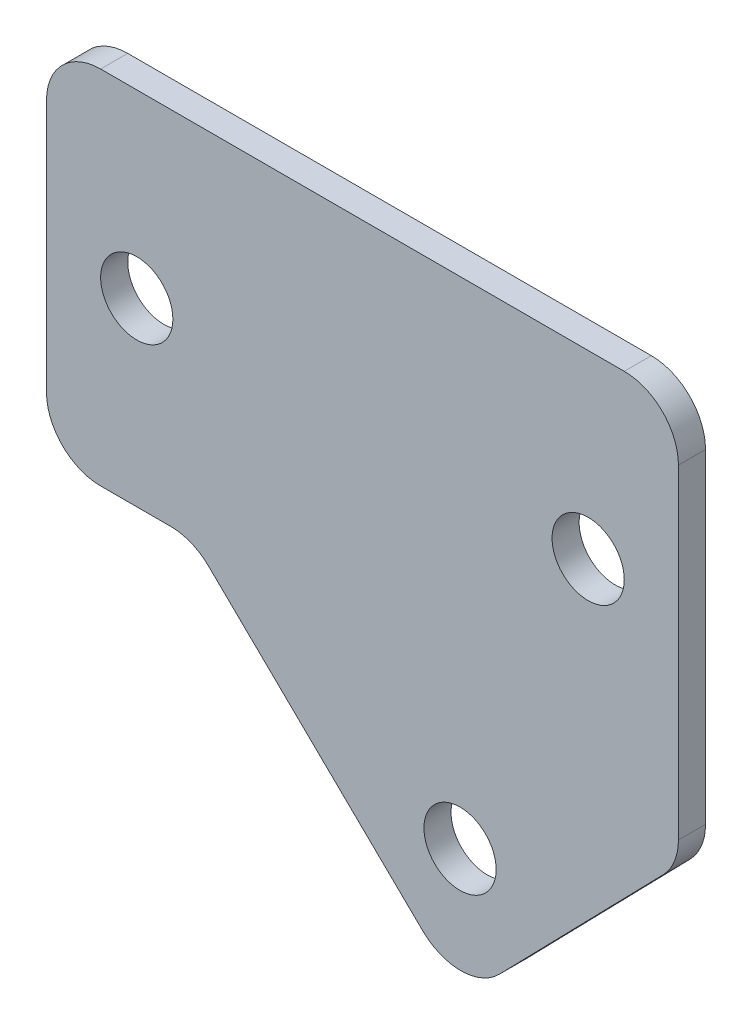
ISO-10303-21;
HEADER;
FILE_DESCRIPTION(('STEP AP214'),'2;1');
FILE_NAME('part.step','',(''),(''),'','','');
FILE_SCHEMA(('AUTOMOTIVE_DESIGN { 1 0 10303 214 1 1 1 1 }'));
ENDSEC;
DATA;
#1=APPLICATION_CONTEXT('core data for automotive mechanical design processes');
#2=APPLICATION_PROTOCOL_DEFINITION('international standard','automotive_design',2000,#1);
#3=PRODUCT_CONTEXT('',#1,'mechanical');
#4=PRODUCT('Part','Part','',(#3));
#5=PRODUCT_RELATED_PRODUCT_CATEGORY('part','',(#4));
#6=PRODUCT_DEFINITION_FORMATION('','',#4);
#7=PRODUCT_DEFINITION_CONTEXT('part definition',#1,'design');
#8=PRODUCT_DEFINITION('design','',#6,#7);
#9=PRODUCT_DEFINITION_SHAPE('','',#8);
#10=(LENGTH_UNIT() NAMED_UNIT(*) SI_UNIT(.MILLI.,.METRE.));
#11=(NAMED_UNIT(*) PLANE_ANGLE_UNIT() SI_UNIT($,.RADIAN.));
#12=(NAMED_UNIT(*) SI_UNIT($,.STERADIAN.) SOLID_ANGLE_UNIT());
#13=UNCERTAINTY_MEASURE_WITH_UNIT(LENGTH_MEASURE(1.E-05),#10,'distance_accuracy_value','');
#14=(GEOMETRIC_REPRESENTATION_CONTEXT(3) GLOBAL_UNCERTAINTY_ASSIGNED_CONTEXT((#13)) GLOBAL_UNIT_ASSIGNED_CONTEXT((#10,
#11,#12)) REPRESENTATION_CONTEXT('',''));
#15=CARTESIAN_POINT('',(0.,0.,0.));
#16=DIRECTION('',(0.,0.,1.));
#17=DIRECTION('',(1.,0.,0.));
#18=AXIS2_PLACEMENT_3D('',#15,#16,#17);
#19=CARTESIAN_POINT('',(-5.94977197285387,-6.10547946473669,1.5));
#20=DIRECTION('',(0.697915467486602,0.716180145105237,0.));
#21=DIRECTION('',(-0.716180145105237,0.697915467486602,0.));
#22=AXIS2_PLACEMENT_3D('',#19,#20,#21);
#23=PLANE('',#22);
#24=DIRECTION('',(0.716180145105237,-0.697915467486602,0.));
#25=VECTOR('',#24,1.);
#26=CARTESIAN_POINT('',(-5.94977197285387,-6.10547946473669,1.5));
#27=LINE('',#26,#25);
#28=CARTESIAN_POINT('',(-8.52874557914507,-3.59227718962217,1.5));
#29=VERTEX_POINT('',#28);
#30=CARTESIAN_POINT('',(3.34728658040838,-15.1654359726023,1.5));
#31=VERTEX_POINT('',#30);
#32=EDGE_CURVE('E141',#29,#31,#27,.T.);
#33=ORIENTED_EDGE('',*,*,#32,.F.);
#34=DIRECTION('',(0.,0.,-1.));
#35=VECTOR('',#34,1.);
#36=CARTESIAN_POINT('',(-8.52874557914507,-3.59227718962217,0.));
#37=LINE('',#36,#35);
#38=CARTESIAN_POINT('',(-8.52874557914507,-3.59227718962217,0.));
#39=VERTEX_POINT('',#38);
#40=EDGE_CURVE('E128',#29,#39,#37,.T.);
#41=ORIENTED_EDGE('',*,*,#40,.T.);
#42=DIRECTION('',(0.716180145105237,-0.697915467486602,0.));
#43=VECTOR('',#42,1.);
#44=CARTESIAN_POINT('',(-5.94977197285387,-6.10547946473669,0.));
#45=LINE('',#44,#43);
#46=CARTESIAN_POINT('',(3.34728658040838,-15.1654359726023,0.));
#47=VERTEX_POINT('',#46);
#48=EDGE_CURVE('E138',#39,#47,#45,.T.);
#49=ORIENTED_EDGE('',*,*,#48,.T.);
#50=DIRECTION('',(0.,0.,-1.));
#51=VECTOR('',#50,1.);
#52=CARTESIAN_POINT('',(3.34728658040838,-15.1654359726023,1.5));
#53=LINE('',#52,#51);
#54=EDGE_CURVE('E143',#47,#31,#53,.F.);
#55=ORIENTED_EDGE('',*,*,#54,.T.);
#56=EDGE_LOOP('',(#33,#41,#49,#55));
#57=FACE_BOUND('',#56,.T.);
#58=ADVANCED_FACE('F35',(#57),#23,.F.);
#59=CARTESIAN_POINT('',(11.445598988578,-11.1537029103254,1.5));
#60=DIRECTION('',(-0.716180145105237,0.697915467486602,0.));
#61=DIRECTION('',(-0.697915467486602,-0.716180145105237,0.));
#62=AXIS2_PLACEMENT_3D('',#59,#60,#61);
#63=PLANE('',#62);
#64=DIRECTION('',(0.697915467486602,0.716180145105237,0.));
#65=VECTOR('',#64,1.);
#66=CARTESIAN_POINT('',(11.445598988578,-11.1537029103254,0.));
#67=LINE('',#66,#65);
#68=CARTESIAN_POINT('',(7.5895734181839,-15.1106419397464,0.));
#69=VERTEX_POINT('',#68);
#70=CARTESIAN_POINT('',(16.6485404353157,-5.81459877251633,0.));
#71=VERTEX_POINT('',#70);
#72=EDGE_CURVE('E150',#69,#71,#67,.T.);
#73=ORIENTED_EDGE('',*,*,#72,.T.);
#74=DIRECTION('',(0.,0.,-1.));
#75=VECTOR('',#74,1.);
#76=CARTESIAN_POINT('',(16.6485404353157,-5.81459877251633,1.5));
#77=LINE('',#76,#75);
#78=CARTESIAN_POINT('',(16.6485404353157,-5.81459877251633,1.5));
#79=VERTEX_POINT('',#78);
#80=EDGE_CURVE('E212',#71,#79,#77,.F.);
#81=ORIENTED_EDGE('',*,*,#80,.T.);
#82=DIRECTION('',(0.697915467486602,0.716180145105237,0.));
#83=VECTOR('',#82,1.);
#84=CARTESIAN_POINT('',(11.445598988578,-11.1537029103254,1.5));
#85=LINE('',#84,#83);
#86=CARTESIAN_POINT('',(7.5895734181839,-15.1106419397464,1.5));
#87=VERTEX_POINT('',#86);
#88=EDGE_CURVE('E297',#87,#79,#85,.T.);
#89=ORIENTED_EDGE('',*,*,#88,.F.);
#90=DIRECTION('',(0.,0.,-1.));
#91=VECTOR('',#90,1.);
#92=CARTESIAN_POINT('',(7.5895734181839,-15.1106419397464,1.5));
#93=LINE('',#92,#91);
#94=EDGE_CURVE('E209',#87,#69,#93,.T.);
#95=ORIENTED_EDGE('',*,*,#94,.T.);
#96=EDGE_LOOP('',(#73,#81,#89,#95));
#97=FACE_BOUND('',#96,.T.);
#98=ADVANCED_FACE('F260',(#97),#63,.F.);
#99=CARTESIAN_POINT('',(17.5,0.,1.5));
#100=DIRECTION('',(-1.,0.,0.));
#101=DIRECTION('',(0.,-1.,0.));
#102=AXIS2_PLACEMENT_3D('',#99,#100,#101);
#103=PLANE('',#102);
#104=DIRECTION('',(0.,1.,0.));
#105=VECTOR('',#104,1.);
#106=CARTESIAN_POINT('',(17.5,0.,0.));
#107=LINE('',#106,#105);
#108=CARTESIAN_POINT('',(17.5,-3.72085237005652,0.));
#109=VERTEX_POINT('',#108);
#110=CARTESIAN_POINT('',(17.5,14.2591823750621,0.));
#111=VERTEX_POINT('',#110);
#112=EDGE_CURVE('E154',#109,#111,#107,.T.);
#113=ORIENTED_EDGE('',*,*,#112,.T.);
#114=DIRECTION('',(0.,0.,-1.));
#115=VECTOR('',#114,1.);
#116=CARTESIAN_POINT('',(17.5,14.2591823750621,1.5));
#117=LINE('',#116,#115);
#118=CARTESIAN_POINT('',(17.5,14.2591823750621,1.5));
#119=VERTEX_POINT('',#118);
#120=EDGE_CURVE('E198',#111,#119,#117,.F.);
#121=ORIENTED_EDGE('',*,*,#120,.T.);
#122=DIRECTION('',(0.,1.,0.));
#123=VECTOR('',#122,1.);
#124=CARTESIAN_POINT('',(17.5,0.,1.5));
#125=LINE('',#124,#123);
#126=CARTESIAN_POINT('',(17.5,-3.72085237005652,1.5));
#127=VERTEX_POINT('',#126);
#128=EDGE_CURVE('E296',#127,#119,#125,.T.);
#129=ORIENTED_EDGE('',*,*,#128,.F.);
#130=DIRECTION('',(0.,0.,-1.));
#131=VECTOR('',#130,1.);
#132=CARTESIAN_POINT('',(17.5,-3.72085237005652,1.5));
#133=LINE('',#132,#131);
#134=EDGE_CURVE('E195',#127,#109,#133,.T.);
#135=ORIENTED_EDGE('',*,*,#134,.T.);
#136=EDGE_LOOP('',(#113,#121,#129,#135));
#137=FACE_BOUND('',#136,.T.);
#138=ADVANCED_FACE('F265',(#137),#103,.F.);
#139=CARTESIAN_POINT('',(0.,17.2591823750621,1.5));
#140=DIRECTION('',(0.,1.,0.));
#141=DIRECTION('',(-1.,0.,0.));
#142=AXIS2_PLACEMENT_3D('',#139,#140,#141);
#143=PLANE('',#142);
#144=DIRECTION('',(1.,0.,0.));
#145=VECTOR('',#144,1.);
#146=CARTESIAN_POINT('',(0.,17.2591823750621,1.5));
#147=LINE('',#146,#145);
#148=CARTESIAN_POINT('',(-14.5,17.2591823750621,1.5));
#149=VERTEX_POINT('',#148);
#150=CARTESIAN_POINT('',(14.5,17.2591823750621,1.5));
#151=VERTEX_POINT('',#150);
#152=EDGE_CURVE('E233',#149,#151,#147,.T.);
#153=ORIENTED_EDGE('',*,*,#152,.T.);
#154=DIRECTION('',(0.,0.,-1.));
#155=VECTOR('',#154,1.);
#156=CARTESIAN_POINT('',(14.5,17.2591823750621,0.));
#157=LINE('',#156,#155);
#158=CARTESIAN_POINT('',(14.5,17.2591823750621,0.));
#159=VERTEX_POINT('',#158);
#160=EDGE_CURVE('E183',#151,#159,#157,.T.);
#161=ORIENTED_EDGE('',*,*,#160,.T.);
#162=DIRECTION('',(1.,0.,0.));
#163=VECTOR('',#162,1.);
#164=CARTESIAN_POINT('',(0.,17.2591823750621,0.));
#165=LINE('',#164,#163);
#166=CARTESIAN_POINT('',(-14.5,17.2591823750621,0.));
#167=VERTEX_POINT('',#166);
#168=EDGE_CURVE('E162',#167,#159,#165,.T.);
#169=ORIENTED_EDGE('',*,*,#168,.F.);
#170=DIRECTION('',(0.,0.,-1.));
#171=VECTOR('',#170,1.);
#172=CARTESIAN_POINT('',(-14.5,17.2591823750621,1.5));
#173=LINE('',#172,#171);
#174=EDGE_CURVE('E181',#167,#149,#173,.F.);
#175=ORIENTED_EDGE('',*,*,#174,.T.);
#176=EDGE_LOOP('',(#153,#161,#169,#175));
#177=FACE_BOUND('',#176,.T.);
#178=ADVANCED_FACE('F291',(#177),#143,.T.);
#179=CARTESIAN_POINT('',(-17.5,0.,1.5));
#180=DIRECTION('',(-1.,0.,0.));
#181=DIRECTION('',(0.,0.,1.));
#182=AXIS2_PLACEMENT_3D('',#179,#180,#181);
#183=PLANE('',#182);
#184=DIRECTION('',(0.,1.,0.));
#185=VECTOR('',#184,1.);
#186=CARTESIAN_POINT('',(-17.5,0.,1.5));
#187=LINE('',#186,#185);
#188=CARTESIAN_POINT('',(-17.5,0.259182375062125,1.5));
#189=VERTEX_POINT('',#188);
#190=CARTESIAN_POINT('',(-17.5,14.2591823750621,1.5));
#191=VERTEX_POINT('',#190);
#192=EDGE_CURVE('E218',#189,#191,#187,.T.);
#193=ORIENTED_EDGE('',*,*,#192,.T.);
#194=DIRECTION('',(0.,0.,-1.));
#195=VECTOR('',#194,1.);
#196=CARTESIAN_POINT('',(-17.5,14.2591823750621,1.5));
#197=LINE('',#196,#195);
#198=CARTESIAN_POINT('',(-17.5,14.2591823750621,0.));
#199=VERTEX_POINT('',#198);
#200=EDGE_CURVE('E134',#191,#199,#197,.T.);
#201=ORIENTED_EDGE('',*,*,#200,.T.);
#202=DIRECTION('',(0.,1.,0.));
#203=VECTOR('',#202,1.);
#204=CARTESIAN_POINT('',(-17.5,0.,0.));
#205=LINE('',#204,#203);
#206=CARTESIAN_POINT('',(-17.5,0.259182375062125,0.));
#207=VERTEX_POINT('',#206);
#208=EDGE_CURVE('E164',#207,#199,#205,.T.);
#209=ORIENTED_EDGE('',*,*,#208,.F.);
#210=DIRECTION('',(0.,0.,-1.));
#211=VECTOR('',#210,1.);
#212=CARTESIAN_POINT('',(-17.5,0.259182375062125,1.5));
#213=LINE('',#212,#211);
#214=EDGE_CURVE('E57',#207,#189,#213,.F.);
#215=ORIENTED_EDGE('',*,*,#214,.T.);
#216=EDGE_LOOP('',(#193,#201,#209,#215));
#217=FACE_BOUND('',#216,.T.);
#218=ADVANCED_FACE('F217',(#217),#183,.T.);
#219=CARTESIAN_POINT('',(-12.5,7.25918237506212,1.5));
#220=DIRECTION('',(0.,0.,-1.));
#221=DIRECTION('',(-1.,0.,0.));
#222=AXIS2_PLACEMENT_3D('',#219,#220,#221);
#223=CYLINDRICAL_SURFACE('',#222,2.);
#224=CARTESIAN_POINT('',(-12.5,7.25918237506212,1.5));
#225=DIRECTION('',(0.,0.,1.));
#226=DIRECTION('',(1.,0.,0.));
#227=AXIS2_PLACEMENT_3D('',#224,#225,#226);
#228=CIRCLE('',#227,2.);
#229=CARTESIAN_POINT('',(-10.5,7.25918237506212,1.5));
#230=VERTEX_POINT('',#229);
#231=EDGE_CURVE('E229',#230,#230,#228,.T.);
#232=ORIENTED_EDGE('',*,*,#231,.T.);
#233=EDGE_LOOP('',(#232));
#234=FACE_BOUND('',#233,.T.);
#235=CARTESIAN_POINT('',(-12.5,7.25918237506212,0.));
#236=DIRECTION('',(0.,0.,1.));
#237=DIRECTION('',(1.,0.,0.));
#238=AXIS2_PLACEMENT_3D('',#235,#236,#237);
#239=CIRCLE('',#238,2.);
#240=CARTESIAN_POINT('',(-10.5,7.25918237506212,0.));
#241=VERTEX_POINT('',#240);
#242=EDGE_CURVE('E169',#241,#241,#239,.T.);
#243=ORIENTED_EDGE('',*,*,#242,.F.);
#244=EDGE_LOOP('',(#243));
#245=FACE_BOUND('',#244,.T.);
#246=ADVANCED_FACE('F325',(#234,#245),#223,.F.);
#247=CARTESIAN_POINT('',(0.,-2.74081762493788,1.5));
#248=DIRECTION('',(0.,1.,0.));
#249=DIRECTION('',(0.,0.,1.));
#250=AXIS2_PLACEMENT_3D('',#247,#248,#249);
#251=PLANE('',#250);
#252=DIRECTION('',(1.,0.,0.));
#253=VECTOR('',#252,1.);
#254=CARTESIAN_POINT('',(0.,-2.74081762493788,0.));
#255=LINE('',#254,#253);
#256=CARTESIAN_POINT('',(-14.5,-2.74081762493788,0.));
#257=VERTEX_POINT('',#256);
#258=CARTESIAN_POINT('',(-10.6224919816049,-2.74081762493788,0.));
#259=VERTEX_POINT('',#258);
#260=EDGE_CURVE('E167',#257,#259,#255,.T.);
#261=ORIENTED_EDGE('',*,*,#260,.T.);
#262=DIRECTION('',(0.,0.,-1.));
#263=VECTOR('',#262,1.);
#264=CARTESIAN_POINT('',(-10.6224919816049,-2.74081762493788,1.5));
#265=LINE('',#264,#263);
#266=CARTESIAN_POINT('',(-10.6224919816049,-2.74081762493788,1.5));
#267=VERTEX_POINT('',#266);
#268=EDGE_CURVE('E129',#259,#267,#265,.F.);
#269=ORIENTED_EDGE('',*,*,#268,.T.);
#270=DIRECTION('',(1.,0.,0.));
#271=VECTOR('',#270,1.);
#272=CARTESIAN_POINT('',(0.,-2.74081762493788,1.5));
#273=LINE('',#272,#271);
#274=CARTESIAN_POINT('',(-14.5,-2.74081762493788,1.5));
#275=VERTEX_POINT('',#274);
#276=EDGE_CURVE('E228',#275,#267,#273,.T.);
#277=ORIENTED_EDGE('',*,*,#276,.F.);
#278=DIRECTION('',(0.,0.,-1.));
#279=VECTOR('',#278,1.);
#280=CARTESIAN_POINT('',(-14.5,-2.74081762493788,0.));
#281=LINE('',#280,#279);
#282=EDGE_CURVE('E142',#275,#257,#281,.T.);
#283=ORIENTED_EDGE('',*,*,#282,.T.);
#284=EDGE_LOOP('',(#261,#269,#277,#283));
#285=FACE_BOUND('',#284,.T.);
#286=ADVANCED_FACE('F226',(#285),#251,.F.);
#287=CARTESIAN_POINT('',(5.40450362763092,-10.1887043121029,1.5));
#288=DIRECTION('',(0.,0.,-1.));
#289=DIRECTION('',(-1.,0.,0.));
#290=AXIS2_PLACEMENT_3D('',#287,#288,#289);
#291=CYLINDRICAL_SURFACE('',#290,2.);
#292=CARTESIAN_POINT('',(5.40450362763092,-10.1887043121029,1.5));
#293=DIRECTION('',(0.,0.,1.));
#294=DIRECTION('',(1.,0.,0.));
#295=AXIS2_PLACEMENT_3D('',#292,#293,#294);
#296=CIRCLE('',#295,2.);
#297=CARTESIAN_POINT('',(7.40450362763092,-10.1887043121029,1.5));
#298=VERTEX_POINT('',#297);
#299=EDGE_CURVE('E175',#298,#298,#296,.T.);
#300=ORIENTED_EDGE('',*,*,#299,.T.);
#301=EDGE_LOOP('',(#300));
#302=FACE_BOUND('',#301,.T.);
#303=CARTESIAN_POINT('',(5.40450362763092,-10.1887043121029,0.));
#304=DIRECTION('',(0.,0.,1.));
#305=DIRECTION('',(1.,0.,0.));
#306=AXIS2_PLACEMENT_3D('',#303,#304,#305);
#307=CIRCLE('',#306,2.);
#308=CARTESIAN_POINT('',(7.40450362763092,-10.1887043121029,0.));
#309=VERTEX_POINT('',#308);
#310=EDGE_CURVE('E151',#309,#309,#307,.T.);
#311=ORIENTED_EDGE('',*,*,#310,.F.);
#312=EDGE_LOOP('',(#311));
#313=FACE_BOUND('',#312,.T.);
#314=ADVANCED_FACE('F244',(#302,#313),#291,.F.);
#315=CARTESIAN_POINT('',(12.5,7.25918237506213,1.5));
#316=DIRECTION('',(0.,0.,-1.));
#317=DIRECTION('',(-1.,0.,0.));
#318=AXIS2_PLACEMENT_3D('',#315,#316,#317);
#319=CYLINDRICAL_SURFACE('',#318,2.);
#320=CARTESIAN_POINT('',(12.5,7.25918237506213,1.5));
#321=DIRECTION('',(0.,0.,1.));
#322=DIRECTION('',(1.,0.,0.));
#323=AXIS2_PLACEMENT_3D('',#320,#321,#322);
#324=CIRCLE('',#323,2.);
#325=CARTESIAN_POINT('',(14.5,7.25918237506213,1.5));
#326=VERTEX_POINT('',#325);
#327=EDGE_CURVE('E176',#326,#326,#324,.F.);
#328=ORIENTED_EDGE('',*,*,#327,.F.);
#329=EDGE_LOOP('',(#328));
#330=FACE_BOUND('',#329,.T.);
#331=CARTESIAN_POINT('',(12.5,7.25918237506213,0.));
#332=DIRECTION('',(0.,0.,1.));
#333=DIRECTION('',(1.,0.,0.));
#334=AXIS2_PLACEMENT_3D('',#331,#332,#333);
#335=CIRCLE('',#334,2.);
#336=CARTESIAN_POINT('',(14.5,7.25918237506213,0.));
#337=VERTEX_POINT('',#336);
#338=EDGE_CURVE('E172',#337,#337,#335,.F.);
#339=ORIENTED_EDGE('',*,*,#338,.T.);
#340=EDGE_LOOP('',(#339));
#341=FACE_BOUND('',#340,.T.);
#342=ADVANCED_FACE('F241',(#330,#341),#319,.F.);
#343=CARTESIAN_POINT('',(0.,0.,1.5));
#344=DIRECTION('',(0.,0.,1.));
#345=DIRECTION('',(1.,0.,0.));
#346=AXIS2_PLACEMENT_3D('',#343,#344,#345);
#347=PLANE('',#346);
#348=ORIENTED_EDGE('',*,*,#299,.F.);
#349=EDGE_LOOP('',(#348));
#350=FACE_BOUND('',#349,.T.);
#351=ORIENTED_EDGE('',*,*,#128,.T.);
#352=CARTESIAN_POINT('',(14.5,14.2591823750621,1.5));
#353=DIRECTION('',(0.,0.,1.));
#354=DIRECTION('',(1.,0.,0.));
#355=AXIS2_PLACEMENT_3D('',#352,#353,#354);
#356=CIRCLE('',#355,3.);
#357=EDGE_CURVE('E207',#119,#151,#356,.T.);
#358=ORIENTED_EDGE('',*,*,#357,.T.);
#359=ORIENTED_EDGE('',*,*,#152,.F.);
#360=CARTESIAN_POINT('',(-14.5,14.2591823750621,1.5));
#361=DIRECTION('',(0.,0.,1.));
#362=DIRECTION('',(1.,0.,0.));
#363=AXIS2_PLACEMENT_3D('',#360,#361,#362);
#364=CIRCLE('',#363,3.);
#365=EDGE_CURVE('E50',#149,#191,#364,.T.);
#366=ORIENTED_EDGE('',*,*,#365,.T.);
#367=ORIENTED_EDGE('',*,*,#192,.F.);
#368=CARTESIAN_POINT('',(-14.5,0.259182375062125,1.5));
#369=DIRECTION('',(0.,0.,1.));
#370=DIRECTION('',(1.,0.,0.));
#371=AXIS2_PLACEMENT_3D('',#368,#369,#370);
#372=CIRCLE('',#371,3.);
#373=EDGE_CURVE('E200',#189,#275,#372,.T.);
#374=ORIENTED_EDGE('',*,*,#373,.T.);
#375=ORIENTED_EDGE('',*,*,#276,.T.);
#376=CARTESIAN_POINT('',(-10.6224919816049,-5.74081762493788,1.5));
#377=DIRECTION('',(0.,0.,1.));
#378=DIRECTION('',(1.,0.,0.));
#379=AXIS2_PLACEMENT_3D('',#376,#377,#378);
#380=CIRCLE('',#379,3.);
#381=EDGE_CURVE('E11',#267,#29,#380,.F.);
#382=ORIENTED_EDGE('',*,*,#381,.T.);
#383=ORIENTED_EDGE('',*,*,#32,.T.);
#384=CARTESIAN_POINT('',(5.44103298286819,-13.0168955372866,1.5));
#385=DIRECTION('',(0.,0.,1.));
#386=DIRECTION('',(1.,0.,0.));
#387=AXIS2_PLACEMENT_3D('',#384,#385,#386);
#388=CIRCLE('',#387,3.);
#389=EDGE_CURVE('E203',#31,#87,#388,.T.);
#390=ORIENTED_EDGE('',*,*,#389,.T.);
#391=ORIENTED_EDGE('',*,*,#88,.T.);
#392=CARTESIAN_POINT('',(14.5,-3.72085237005652,1.5));
#393=DIRECTION('',(0.,0.,1.));
#394=DIRECTION('',(1.,0.,0.));
#395=AXIS2_PLACEMENT_3D('',#392,#393,#394);
#396=CIRCLE('',#395,3.);
#397=EDGE_CURVE('E205',#79,#127,#396,.T.);
#398=ORIENTED_EDGE('',*,*,#397,.T.);
#399=EDGE_LOOP('',(#351,#358,#359,#366,#367,#374,#375,#382,#383,#390,#391,#398));
#400=FACE_BOUND('',#399,.T.);
#401=ORIENTED_EDGE('',*,*,#231,.F.);
#402=EDGE_LOOP('',(#401));
#403=FACE_BOUND('',#402,.T.);
#404=ORIENTED_EDGE('',*,*,#327,.T.);
#405=EDGE_LOOP('',(#404));
#406=FACE_BOUND('',#405,.T.);
#407=ADVANCED_FACE('F239',(#350,#400,#403,#406),#347,.T.);
#408=CARTESIAN_POINT('',(0.,0.,0.));
#409=DIRECTION('',(0.,0.,1.));
#410=DIRECTION('',(1.,0.,0.));
#411=AXIS2_PLACEMENT_3D('',#408,#409,#410);
#412=PLANE('',#411);
#413=ORIENTED_EDGE('',*,*,#310,.T.);
#414=EDGE_LOOP('',(#413));
#415=FACE_BOUND('',#414,.T.);
#416=ORIENTED_EDGE('',*,*,#168,.T.);
#417=CARTESIAN_POINT('',(14.5,14.2591823750621,0.));
#418=DIRECTION('',(0.,0.,1.));
#419=DIRECTION('',(1.,0.,0.));
#420=AXIS2_PLACEMENT_3D('',#417,#418,#419);
#421=CIRCLE('',#420,3.);
#422=EDGE_CURVE('E193',#159,#111,#421,.F.);
#423=ORIENTED_EDGE('',*,*,#422,.T.);
#424=ORIENTED_EDGE('',*,*,#112,.F.);
#425=CARTESIAN_POINT('',(14.5,-3.72085237005652,0.));
#426=DIRECTION('',(0.,0.,1.));
#427=DIRECTION('',(1.,0.,0.));
#428=AXIS2_PLACEMENT_3D('',#425,#426,#427);
#429=CIRCLE('',#428,3.);
#430=EDGE_CURVE('E191',#109,#71,#429,.F.);
#431=ORIENTED_EDGE('',*,*,#430,.T.);
#432=ORIENTED_EDGE('',*,*,#72,.F.);
#433=CARTESIAN_POINT('',(5.44103298286819,-13.0168955372866,0.));
#434=DIRECTION('',(0.,0.,1.));
#435=DIRECTION('',(1.,0.,0.));
#436=AXIS2_PLACEMENT_3D('',#433,#434,#435);
#437=CIRCLE('',#436,3.);
#438=EDGE_CURVE('E149',#69,#47,#437,.F.);
#439=ORIENTED_EDGE('',*,*,#438,.T.);
#440=ORIENTED_EDGE('',*,*,#48,.F.);
#441=CARTESIAN_POINT('',(-10.6224919816049,-5.74081762493788,0.));
#442=DIRECTION('',(0.,0.,1.));
#443=DIRECTION('',(1.,0.,0.));
#444=AXIS2_PLACEMENT_3D('',#441,#442,#443);
#445=CIRCLE('',#444,3.);
#446=EDGE_CURVE('E43',#39,#259,#445,.T.);
#447=ORIENTED_EDGE('',*,*,#446,.T.);
#448=ORIENTED_EDGE('',*,*,#260,.F.);
#449=CARTESIAN_POINT('',(-14.5,0.259182375062125,0.));
#450=DIRECTION('',(0.,0.,1.));
#451=DIRECTION('',(1.,0.,0.));
#452=AXIS2_PLACEMENT_3D('',#449,#450,#451);
#453=CIRCLE('',#452,3.);
#454=EDGE_CURVE('E186',#257,#207,#453,.F.);
#455=ORIENTED_EDGE('',*,*,#454,.T.);
#456=ORIENTED_EDGE('',*,*,#208,.T.);
#457=CARTESIAN_POINT('',(-14.5,14.2591823750621,0.));
#458=DIRECTION('',(0.,0.,1.));
#459=DIRECTION('',(1.,0.,0.));
#460=AXIS2_PLACEMENT_3D('',#457,#458,#459);
#461=CIRCLE('',#460,3.);
#462=EDGE_CURVE('E188',#199,#167,#461,.F.);
#463=ORIENTED_EDGE('',*,*,#462,.T.);
#464=EDGE_LOOP('',(#416,#423,#424,#431,#432,#439,#440,#447,#448,#455,#456,#463));
#465=FACE_BOUND('',#464,.T.);
#466=ORIENTED_EDGE('',*,*,#242,.T.);
#467=EDGE_LOOP('',(#466));
#468=FACE_BOUND('',#467,.T.);
#469=ORIENTED_EDGE('',*,*,#338,.F.);
#470=EDGE_LOOP('',(#469));
#471=FACE_BOUND('',#470,.T.);
#472=ADVANCED_FACE('F146',(#415,#465,#468,#471),#412,.F.);
#473=CARTESIAN_POINT('',(-10.6224919816049,-5.74081762493788,1.5));
#474=DIRECTION('',(0.,0.,1.));
#475=DIRECTION('',(1.,0.,0.));
#476=AXIS2_PLACEMENT_3D('',#473,#474,#475);
#477=CYLINDRICAL_SURFACE('',#476,3.);
#478=ORIENTED_EDGE('',*,*,#381,.F.);
#479=ORIENTED_EDGE('',*,*,#268,.F.);
#480=ORIENTED_EDGE('',*,*,#446,.F.);
#481=ORIENTED_EDGE('',*,*,#40,.F.);
#482=EDGE_LOOP('',(#478,#479,#480,#481));
#483=FACE_BOUND('',#482,.T.);
#484=ADVANCED_FACE('F127',(#483),#477,.F.);
#485=CARTESIAN_POINT('',(14.5,14.2591823750621,1.5));
#486=DIRECTION('',(0.,0.,1.));
#487=DIRECTION('',(1.,0.,0.));
#488=AXIS2_PLACEMENT_3D('',#485,#486,#487);
#489=CYLINDRICAL_SURFACE('',#488,3.);
#490=ORIENTED_EDGE('',*,*,#357,.F.);
#491=ORIENTED_EDGE('',*,*,#120,.F.);
#492=ORIENTED_EDGE('',*,*,#422,.F.);
#493=ORIENTED_EDGE('',*,*,#160,.F.);
#494=EDGE_LOOP('',(#490,#491,#492,#493));
#495=FACE_BOUND('',#494,.T.);
#496=ADVANCED_FACE('F255',(#495),#489,.T.);
#497=CARTESIAN_POINT('',(14.5,-3.72085237005652,1.5));
#498=DIRECTION('',(0.,0.,-1.));
#499=DIRECTION('',(-1.,0.,0.));
#500=AXIS2_PLACEMENT_3D('',#497,#498,#499);
#501=CYLINDRICAL_SURFACE('',#500,3.);
#502=ORIENTED_EDGE('',*,*,#397,.F.);
#503=ORIENTED_EDGE('',*,*,#80,.F.);
#504=ORIENTED_EDGE('',*,*,#430,.F.);
#505=ORIENTED_EDGE('',*,*,#134,.F.);
#506=EDGE_LOOP('',(#502,#503,#504,#505));
#507=FACE_BOUND('',#506,.T.);
#508=ADVANCED_FACE('F275',(#507),#501,.T.);
#509=CARTESIAN_POINT('',(5.44103298286819,-13.0168955372866,1.5));
#510=DIRECTION('',(0.,0.,-1.));
#511=DIRECTION('',(-1.,0.,0.));
#512=AXIS2_PLACEMENT_3D('',#509,#510,#511);
#513=CYLINDRICAL_SURFACE('',#512,3.);
#514=ORIENTED_EDGE('',*,*,#389,.F.);
#515=ORIENTED_EDGE('',*,*,#54,.F.);
#516=ORIENTED_EDGE('',*,*,#438,.F.);
#517=ORIENTED_EDGE('',*,*,#94,.F.);
#518=EDGE_LOOP('',(#514,#515,#516,#517));
#519=FACE_BOUND('',#518,.T.);
#520=ADVANCED_FACE('F279',(#519),#513,.T.);
#521=CARTESIAN_POINT('',(-14.5,14.2591823750621,1.5));
#522=DIRECTION('',(0.,0.,-1.));
#523=DIRECTION('',(-1.,0.,0.));
#524=AXIS2_PLACEMENT_3D('',#521,#522,#523);
#525=CYLINDRICAL_SURFACE('',#524,3.);
#526=ORIENTED_EDGE('',*,*,#365,.F.);
#527=ORIENTED_EDGE('',*,*,#174,.F.);
#528=ORIENTED_EDGE('',*,*,#462,.F.);
#529=ORIENTED_EDGE('',*,*,#200,.F.);
#530=EDGE_LOOP('',(#526,#527,#528,#529));
#531=FACE_BOUND('',#530,.T.);
#532=ADVANCED_FACE('F282',(#531),#525,.T.);
#533=CARTESIAN_POINT('',(-14.5,0.259182375062125,1.5));
#534=DIRECTION('',(0.,0.,1.));
#535=DIRECTION('',(1.,0.,0.));
#536=AXIS2_PLACEMENT_3D('',#533,#534,#535);
#537=CYLINDRICAL_SURFACE('',#536,3.);
#538=ORIENTED_EDGE('',*,*,#373,.F.);
#539=ORIENTED_EDGE('',*,*,#214,.F.);
#540=ORIENTED_EDGE('',*,*,#454,.F.);
#541=ORIENTED_EDGE('',*,*,#282,.F.);
#542=EDGE_LOOP('',(#538,#539,#540,#541));
#543=FACE_BOUND('',#542,.T.);
#544=ADVANCED_FACE('F37',(#543),#537,.T.);
#545=CLOSED_SHELL('',(#58,#98,#138,#178,#218,#246,#286,#314,#342,#407,#472,#484,#496,#508,#520,
#532,#544));
#546=MANIFOLD_SOLID_BREP('B2',#545);
#547=ADVANCED_BREP_SHAPE_REPRESENTATION('',(#18,#546),#14);
#548=SHAPE_DEFINITION_REPRESENTATION(#9,#547);
ENDSEC;
END-ISO-10303-21;
